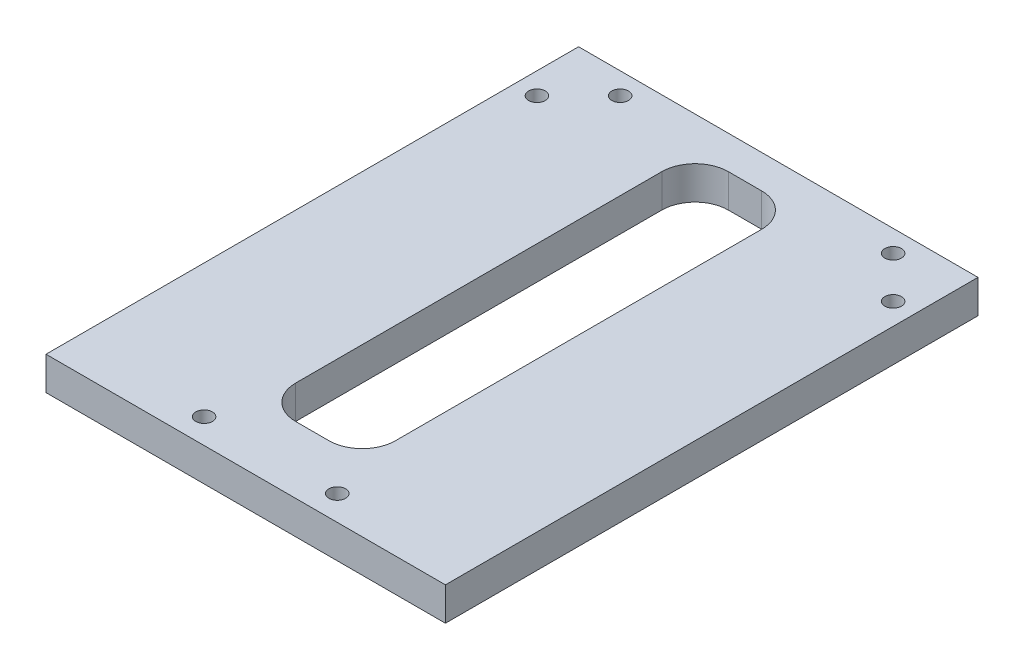
ISO-10303-21;
HEADER;
FILE_DESCRIPTION(('STEP AP214'),'2;1');
FILE_NAME('part.step','',(''),(''),'','','');
FILE_SCHEMA(('AUTOMOTIVE_DESIGN { 1 0 10303 214 1 1 1 1 }'));
ENDSEC;
DATA;
#1=APPLICATION_CONTEXT('core data for automotive mechanical design processes');
#2=APPLICATION_PROTOCOL_DEFINITION('international standard','automotive_design',2000,#1);
#3=PRODUCT_CONTEXT('',#1,'mechanical');
#4=PRODUCT('Part','Part','',(#3));
#5=PRODUCT_RELATED_PRODUCT_CATEGORY('part','',(#4));
#6=PRODUCT_DEFINITION_FORMATION('','',#4);
#7=PRODUCT_DEFINITION_CONTEXT('part definition',#1,'design');
#8=PRODUCT_DEFINITION('design','',#6,#7);
#9=PRODUCT_DEFINITION_SHAPE('','',#8);
#10=(LENGTH_UNIT() NAMED_UNIT(*) SI_UNIT(.MILLI.,.METRE.));
#11=(NAMED_UNIT(*) PLANE_ANGLE_UNIT() SI_UNIT($,.RADIAN.));
#12=(NAMED_UNIT(*) SI_UNIT($,.STERADIAN.) SOLID_ANGLE_UNIT());
#13=UNCERTAINTY_MEASURE_WITH_UNIT(LENGTH_MEASURE(1.E-05),#10,'distance_accuracy_value','');
#14=(GEOMETRIC_REPRESENTATION_CONTEXT(3) GLOBAL_UNCERTAINTY_ASSIGNED_CONTEXT((#13)) GLOBAL_UNIT_ASSIGNED_CONTEXT((#10,
#11,#12)) REPRESENTATION_CONTEXT('',''));
#15=CARTESIAN_POINT('',(0.,0.,0.));
#16=DIRECTION('',(0.,0.,1.));
#17=DIRECTION('',(1.,0.,0.));
#18=AXIS2_PLACEMENT_3D('',#15,#16,#17);
#19=CARTESIAN_POINT('',(19.,-90.,-153.5));
#20=DIRECTION('',(0.,1.,0.));
#21=DIRECTION('',(0.,0.,1.));
#22=AXIS2_PLACEMENT_3D('',#19,#20,#21);
#23=CYLINDRICAL_SURFACE('',#22,2.5);
#24=CARTESIAN_POINT('',(19.,10.,-153.5));
#25=DIRECTION('',(0.,1.,0.));
#26=DIRECTION('',(0.,0.,1.));
#27=AXIS2_PLACEMENT_3D('',#24,#25,#26);
#28=CIRCLE('',#27,2.5);
#29=CARTESIAN_POINT('',(19.,10.,-151.));
#30=VERTEX_POINT('',#29);
#31=EDGE_CURVE('E290',#30,#30,#28,.T.);
#32=ORIENTED_EDGE('',*,*,#31,.T.);
#33=EDGE_LOOP('',(#32));
#34=FACE_BOUND('',#33,.T.);
#35=CARTESIAN_POINT('',(19.,5.,-153.5));
#36=DIRECTION('',(0.,-1.,0.));
#37=DIRECTION('',(0.,0.,-1.));
#38=AXIS2_PLACEMENT_3D('',#35,#36,#37);
#39=CIRCLE('',#38,2.5);
#40=CARTESIAN_POINT('',(19.,5.,-156.));
#41=VERTEX_POINT('',#40);
#42=EDGE_CURVE('E208',#41,#41,#39,.F.);
#43=ORIENTED_EDGE('',*,*,#42,.F.);
#44=EDGE_LOOP('',(#43));
#45=FACE_BOUND('',#44,.T.);
#46=ADVANCED_FACE('F50',(#34,#45),#23,.F.);
#47=CARTESIAN_POINT('',(6.5,-90.,-141.));
#48=DIRECTION('',(0.,1.,0.));
#49=DIRECTION('',(0.,0.,1.));
#50=AXIS2_PLACEMENT_3D('',#47,#48,#49);
#51=CYLINDRICAL_SURFACE('',#50,2.5);
#52=CARTESIAN_POINT('',(6.5,10.,-141.));
#53=DIRECTION('',(0.,1.,0.));
#54=DIRECTION('',(0.,0.,1.));
#55=AXIS2_PLACEMENT_3D('',#52,#53,#54);
#56=CIRCLE('',#55,2.5);
#57=CARTESIAN_POINT('',(6.5,10.,-138.5));
#58=VERTEX_POINT('',#57);
#59=EDGE_CURVE('E292',#58,#58,#56,.T.);
#60=ORIENTED_EDGE('',*,*,#59,.T.);
#61=EDGE_LOOP('',(#60));
#62=FACE_BOUND('',#61,.T.);
#63=CARTESIAN_POINT('',(6.5,5.,-141.));
#64=DIRECTION('',(0.,-1.,0.));
#65=DIRECTION('',(0.,0.,-1.));
#66=AXIS2_PLACEMENT_3D('',#63,#64,#65);
#67=CIRCLE('',#66,2.5);
#68=CARTESIAN_POINT('',(6.5,5.,-143.5));
#69=VERTEX_POINT('',#68);
#70=EDGE_CURVE('E210',#69,#69,#67,.F.);
#71=ORIENTED_EDGE('',*,*,#70,.F.);
#72=EDGE_LOOP('',(#71));
#73=FACE_BOUND('',#72,.T.);
#74=ADVANCED_FACE('F356',(#62,#73),#51,.F.);
#75=CARTESIAN_POINT('',(113.5,-90.,-141.));
#76=DIRECTION('',(0.,1.,0.));
#77=DIRECTION('',(0.,0.,1.));
#78=AXIS2_PLACEMENT_3D('',#75,#76,#77);
#79=CYLINDRICAL_SURFACE('',#78,2.5);
#80=CARTESIAN_POINT('',(113.5,10.,-141.));
#81=DIRECTION('',(0.,1.,0.));
#82=DIRECTION('',(0.,0.,1.));
#83=AXIS2_PLACEMENT_3D('',#80,#81,#82);
#84=CIRCLE('',#83,2.5);
#85=CARTESIAN_POINT('',(113.5,10.,-138.5));
#86=VERTEX_POINT('',#85);
#87=EDGE_CURVE('E214',#86,#86,#84,.T.);
#88=ORIENTED_EDGE('',*,*,#87,.T.);
#89=EDGE_LOOP('',(#88));
#90=FACE_BOUND('',#89,.T.);
#91=CARTESIAN_POINT('',(113.5,5.,-141.));
#92=DIRECTION('',(0.,-1.,0.));
#93=DIRECTION('',(0.,0.,-1.));
#94=AXIS2_PLACEMENT_3D('',#91,#92,#93);
#95=CIRCLE('',#94,2.5);
#96=CARTESIAN_POINT('',(113.5,5.,-143.5));
#97=VERTEX_POINT('',#96);
#98=EDGE_CURVE('E202',#97,#97,#95,.F.);
#99=ORIENTED_EDGE('',*,*,#98,.F.);
#100=EDGE_LOOP('',(#99));
#101=FACE_BOUND('',#100,.T.);
#102=ADVANCED_FACE('F362',(#90,#101),#79,.F.);
#103=CARTESIAN_POINT('',(101.,-90.,-153.5));
#104=DIRECTION('',(0.,1.,0.));
#105=DIRECTION('',(0.,0.,1.));
#106=AXIS2_PLACEMENT_3D('',#103,#104,#105);
#107=CYLINDRICAL_SURFACE('',#106,2.50000000000001);
#108=CARTESIAN_POINT('',(101.,10.,-153.5));
#109=DIRECTION('',(0.,1.,0.));
#110=DIRECTION('',(0.,0.,1.));
#111=AXIS2_PLACEMENT_3D('',#108,#109,#110);
#112=CIRCLE('',#111,2.50000000000001);
#113=CARTESIAN_POINT('',(101.,10.,-151.));
#114=VERTEX_POINT('',#113);
#115=EDGE_CURVE('E288',#114,#114,#112,.T.);
#116=ORIENTED_EDGE('',*,*,#115,.T.);
#117=EDGE_LOOP('',(#116));
#118=FACE_BOUND('',#117,.T.);
#119=CARTESIAN_POINT('',(101.,5.,-153.5));
#120=DIRECTION('',(0.,-1.,0.));
#121=DIRECTION('',(0.,0.,-1.));
#122=AXIS2_PLACEMENT_3D('',#119,#120,#121);
#123=CIRCLE('',#122,2.50000000000001);
#124=CARTESIAN_POINT('',(101.,5.,-156.));
#125=VERTEX_POINT('',#124);
#126=EDGE_CURVE('E197',#125,#125,#123,.F.);
#127=ORIENTED_EDGE('',*,*,#126,.F.);
#128=EDGE_LOOP('',(#127));
#129=FACE_BOUND('',#128,.T.);
#130=ADVANCED_FACE('F375',(#118,#129),#107,.F.);
#131=CARTESIAN_POINT('',(0.,10.,0.));
#132=DIRECTION('',(0.,0.,-1.));
#133=DIRECTION('',(-1.,0.,0.));
#134=AXIS2_PLACEMENT_3D('',#131,#132,#133);
#135=PLANE('',#134);
#136=DIRECTION('',(1.,0.,0.));
#137=VECTOR('',#136,1.);
#138=CARTESIAN_POINT('',(0.,0.,0.));
#139=LINE('',#138,#137);
#140=CARTESIAN_POINT('',(0.,0.,0.));
#141=VERTEX_POINT('',#140);
#142=CARTESIAN_POINT('',(120.,0.,0.));
#143=VERTEX_POINT('',#142);
#144=EDGE_CURVE('E162',#141,#143,#139,.T.);
#145=ORIENTED_EDGE('',*,*,#144,.T.);
#146=DIRECTION('',(0.,-1.,0.));
#147=VECTOR('',#146,1.);
#148=CARTESIAN_POINT('',(120.,10.,0.));
#149=LINE('',#148,#147);
#150=CARTESIAN_POINT('',(120.,10.,0.));
#151=VERTEX_POINT('',#150);
#152=EDGE_CURVE('E141',#151,#143,#149,.T.);
#153=ORIENTED_EDGE('',*,*,#152,.F.);
#154=DIRECTION('',(1.,0.,0.));
#155=VECTOR('',#154,1.);
#156=CARTESIAN_POINT('',(0.,10.,0.));
#157=LINE('',#156,#155);
#158=CARTESIAN_POINT('',(0.,10.,0.));
#159=VERTEX_POINT('',#158);
#160=EDGE_CURVE('E148',#159,#151,#157,.T.);
#161=ORIENTED_EDGE('',*,*,#160,.F.);
#162=DIRECTION('',(0.,-1.,0.));
#163=VECTOR('',#162,1.);
#164=CARTESIAN_POINT('',(0.,10.,0.));
#165=LINE('',#164,#163);
#166=EDGE_CURVE('E311',#159,#141,#165,.T.);
#167=ORIENTED_EDGE('',*,*,#166,.T.);
#168=EDGE_LOOP('',(#145,#153,#161,#167));
#169=FACE_BOUND('',#168,.T.);
#170=ADVANCED_FACE('F156',(#169),#135,.F.);
#171=CARTESIAN_POINT('',(120.,10.,0.));
#172=DIRECTION('',(-1.,0.,0.));
#173=DIRECTION('',(0.,0.,1.));
#174=AXIS2_PLACEMENT_3D('',#171,#172,#173);
#175=PLANE('',#174);
#176=DIRECTION('',(0.,0.,-1.));
#177=VECTOR('',#176,1.);
#178=CARTESIAN_POINT('',(120.,0.,0.));
#179=LINE('',#178,#177);
#180=CARTESIAN_POINT('',(120.,0.,-160.));
#181=VERTEX_POINT('',#180);
#182=EDGE_CURVE('E321',#143,#181,#179,.T.);
#183=ORIENTED_EDGE('',*,*,#182,.T.);
#184=DIRECTION('',(0.,-1.,0.));
#185=VECTOR('',#184,1.);
#186=CARTESIAN_POINT('',(120.,10.,-160.));
#187=LINE('',#186,#185);
#188=CARTESIAN_POINT('',(120.,10.,-160.));
#189=VERTEX_POINT('',#188);
#190=EDGE_CURVE('E143',#189,#181,#187,.T.);
#191=ORIENTED_EDGE('',*,*,#190,.F.);
#192=DIRECTION('',(0.,0.,-1.));
#193=VECTOR('',#192,1.);
#194=CARTESIAN_POINT('',(120.,10.,0.));
#195=LINE('',#194,#193);
#196=EDGE_CURVE('E137',#151,#189,#195,.T.);
#197=ORIENTED_EDGE('',*,*,#196,.F.);
#198=ORIENTED_EDGE('',*,*,#152,.T.);
#199=EDGE_LOOP('',(#183,#191,#197,#198));
#200=FACE_BOUND('',#199,.T.);
#201=ADVANCED_FACE('F142',(#200),#175,.F.);
#202=CARTESIAN_POINT('',(0.,10.,-160.));
#203=DIRECTION('',(0.,0.,-1.));
#204=DIRECTION('',(-1.,0.,0.));
#205=AXIS2_PLACEMENT_3D('',#202,#203,#204);
#206=PLANE('',#205);
#207=DIRECTION('',(1.,0.,0.));
#208=VECTOR('',#207,1.);
#209=CARTESIAN_POINT('',(0.,0.,-160.));
#210=LINE('',#209,#208);
#211=CARTESIAN_POINT('',(0.,0.,-160.));
#212=VERTEX_POINT('',#211);
#213=EDGE_CURVE('E329',#212,#181,#210,.T.);
#214=ORIENTED_EDGE('',*,*,#213,.F.);
#215=DIRECTION('',(0.,-1.,0.));
#216=VECTOR('',#215,1.);
#217=CARTESIAN_POINT('',(0.,10.,-160.));
#218=LINE('',#217,#216);
#219=CARTESIAN_POINT('',(0.,10.,-160.));
#220=VERTEX_POINT('',#219);
#221=EDGE_CURVE('E170',#220,#212,#218,.T.);
#222=ORIENTED_EDGE('',*,*,#221,.F.);
#223=DIRECTION('',(1.,0.,0.));
#224=VECTOR('',#223,1.);
#225=CARTESIAN_POINT('',(0.,10.,-160.));
#226=LINE('',#225,#224);
#227=EDGE_CURVE('E146',#220,#189,#226,.T.);
#228=ORIENTED_EDGE('',*,*,#227,.T.);
#229=ORIENTED_EDGE('',*,*,#190,.T.);
#230=EDGE_LOOP('',(#214,#222,#228,#229));
#231=FACE_BOUND('',#230,.T.);
#232=ADVANCED_FACE('F337',(#231),#206,.T.);
#233=CARTESIAN_POINT('',(75.,10.,0.));
#234=DIRECTION('',(1.,0.,0.));
#235=DIRECTION('',(0.,0.,-1.));
#236=AXIS2_PLACEMENT_3D('',#233,#234,#235);
#237=PLANE('',#236);
#238=DIRECTION('',(0.,0.,1.));
#239=VECTOR('',#238,1.);
#240=CARTESIAN_POINT('',(75.,0.,0.));
#241=LINE('',#240,#239);
#242=CARTESIAN_POINT('',(75.,0.,-140.));
#243=VERTEX_POINT('',#242);
#244=CARTESIAN_POINT('',(75.,0.,-30.));
#245=VERTEX_POINT('',#244);
#246=EDGE_CURVE('E294',#243,#245,#241,.T.);
#247=ORIENTED_EDGE('',*,*,#246,.T.);
#248=DIRECTION('',(0.,-1.,0.));
#249=VECTOR('',#248,1.);
#250=CARTESIAN_POINT('',(75.,10.,-30.));
#251=LINE('',#250,#249);
#252=CARTESIAN_POINT('',(75.,10.,-30.));
#253=VERTEX_POINT('',#252);
#254=EDGE_CURVE('E181',#245,#253,#251,.F.);
#255=ORIENTED_EDGE('',*,*,#254,.T.);
#256=DIRECTION('',(0.,0.,1.));
#257=VECTOR('',#256,1.);
#258=CARTESIAN_POINT('',(75.,10.,0.));
#259=LINE('',#258,#257);
#260=CARTESIAN_POINT('',(75.,10.,-140.));
#261=VERTEX_POINT('',#260);
#262=EDGE_CURVE('E296',#261,#253,#259,.T.);
#263=ORIENTED_EDGE('',*,*,#262,.F.);
#264=DIRECTION('',(0.,-1.,0.));
#265=VECTOR('',#264,1.);
#266=CARTESIAN_POINT('',(75.,10.,-140.));
#267=LINE('',#266,#265);
#268=EDGE_CURVE('E178',#261,#243,#267,.T.);
#269=ORIENTED_EDGE('',*,*,#268,.T.);
#270=EDGE_LOOP('',(#247,#255,#263,#269));
#271=FACE_BOUND('',#270,.T.);
#272=ADVANCED_FACE('F483',(#271),#237,.F.);
#273=CARTESIAN_POINT('',(0.,10.,-20.));
#274=DIRECTION('',(0.,0.,-1.));
#275=DIRECTION('',(-1.,0.,0.));
#276=AXIS2_PLACEMENT_3D('',#273,#274,#275);
#277=PLANE('',#276);
#278=DIRECTION('',(1.,0.,0.));
#279=VECTOR('',#278,1.);
#280=CARTESIAN_POINT('',(0.,0.,-20.));
#281=LINE('',#280,#279);
#282=CARTESIAN_POINT('',(55.,0.,-20.));
#283=VERTEX_POINT('',#282);
#284=CARTESIAN_POINT('',(65.,0.,-20.));
#285=VERTEX_POINT('',#284);
#286=EDGE_CURVE('E313',#283,#285,#281,.T.);
#287=ORIENTED_EDGE('',*,*,#286,.F.);
#288=DIRECTION('',(0.,-1.,0.));
#289=VECTOR('',#288,1.);
#290=CARTESIAN_POINT('',(55.,10.,-20.));
#291=LINE('',#290,#289);
#292=CARTESIAN_POINT('',(55.,10.,-20.));
#293=VERTEX_POINT('',#292);
#294=EDGE_CURVE('E176',#283,#293,#291,.F.);
#295=ORIENTED_EDGE('',*,*,#294,.T.);
#296=DIRECTION('',(1.,0.,0.));
#297=VECTOR('',#296,1.);
#298=CARTESIAN_POINT('',(0.,10.,-20.));
#299=LINE('',#298,#297);
#300=CARTESIAN_POINT('',(65.,10.,-20.));
#301=VERTEX_POINT('',#300);
#302=EDGE_CURVE('E301',#293,#301,#299,.T.);
#303=ORIENTED_EDGE('',*,*,#302,.T.);
#304=DIRECTION('',(0.,-1.,0.));
#305=VECTOR('',#304,1.);
#306=CARTESIAN_POINT('',(65.,10.,-20.));
#307=LINE('',#306,#305);
#308=EDGE_CURVE('E173',#301,#285,#307,.T.);
#309=ORIENTED_EDGE('',*,*,#308,.T.);
#310=EDGE_LOOP('',(#287,#295,#303,#309));
#311=FACE_BOUND('',#310,.T.);
#312=ADVANCED_FACE('F490',(#311),#277,.T.);
#313=CARTESIAN_POINT('',(45.,10.,0.));
#314=DIRECTION('',(1.,0.,0.));
#315=DIRECTION('',(0.,0.,-1.));
#316=AXIS2_PLACEMENT_3D('',#313,#314,#315);
#317=PLANE('',#316);
#318=DIRECTION('',(0.,0.,1.));
#319=VECTOR('',#318,1.);
#320=CARTESIAN_POINT('',(45.,10.,0.));
#321=LINE('',#320,#319);
#322=CARTESIAN_POINT('',(45.,10.,-140.));
#323=VERTEX_POINT('',#322);
#324=CARTESIAN_POINT('',(45.,10.,-30.));
#325=VERTEX_POINT('',#324);
#326=EDGE_CURVE('E304',#323,#325,#321,.T.);
#327=ORIENTED_EDGE('',*,*,#326,.T.);
#328=DIRECTION('',(0.,-1.,0.));
#329=VECTOR('',#328,1.);
#330=CARTESIAN_POINT('',(45.,0.,-30.));
#331=LINE('',#330,#329);
#332=CARTESIAN_POINT('',(45.,0.,-30.));
#333=VERTEX_POINT('',#332);
#334=EDGE_CURVE('E164',#325,#333,#331,.T.);
#335=ORIENTED_EDGE('',*,*,#334,.T.);
#336=DIRECTION('',(0.,0.,1.));
#337=VECTOR('',#336,1.);
#338=CARTESIAN_POINT('',(45.,0.,0.));
#339=LINE('',#338,#337);
#340=CARTESIAN_POINT('',(45.,0.,-140.));
#341=VERTEX_POINT('',#340);
#342=EDGE_CURVE('E320',#341,#333,#339,.T.);
#343=ORIENTED_EDGE('',*,*,#342,.F.);
#344=DIRECTION('',(0.,-1.,0.));
#345=VECTOR('',#344,1.);
#346=CARTESIAN_POINT('',(45.,10.,-140.));
#347=LINE('',#346,#345);
#348=EDGE_CURVE('E161',#341,#323,#347,.F.);
#349=ORIENTED_EDGE('',*,*,#348,.T.);
#350=EDGE_LOOP('',(#327,#335,#343,#349));
#351=FACE_BOUND('',#350,.T.);
#352=ADVANCED_FACE('F496',(#351),#317,.T.);
#353=CARTESIAN_POINT('',(0.,10.,-150.));
#354=DIRECTION('',(0.,0.,1.));
#355=DIRECTION('',(1.,0.,0.));
#356=AXIS2_PLACEMENT_3D('',#353,#354,#355);
#357=PLANE('',#356);
#358=DIRECTION('',(-1.,0.,0.));
#359=VECTOR('',#358,1.);
#360=CARTESIAN_POINT('',(0.,0.,-150.));
#361=LINE('',#360,#359);
#362=CARTESIAN_POINT('',(65.,0.,-150.));
#363=VERTEX_POINT('',#362);
#364=CARTESIAN_POINT('',(55.,0.,-150.));
#365=VERTEX_POINT('',#364);
#366=EDGE_CURVE('E318',#363,#365,#361,.T.);
#367=ORIENTED_EDGE('',*,*,#366,.F.);
#368=DIRECTION('',(0.,-1.,0.));
#369=VECTOR('',#368,1.);
#370=CARTESIAN_POINT('',(65.,10.,-150.));
#371=LINE('',#370,#369);
#372=CARTESIAN_POINT('',(65.,10.,-150.));
#373=VERTEX_POINT('',#372);
#374=EDGE_CURVE('E68',#363,#373,#371,.F.);
#375=ORIENTED_EDGE('',*,*,#374,.T.);
#376=DIRECTION('',(-1.,0.,0.));
#377=VECTOR('',#376,1.);
#378=CARTESIAN_POINT('',(0.,10.,-150.));
#379=LINE('',#378,#377);
#380=CARTESIAN_POINT('',(55.,10.,-150.));
#381=VERTEX_POINT('',#380);
#382=EDGE_CURVE('E157',#373,#381,#379,.T.);
#383=ORIENTED_EDGE('',*,*,#382,.T.);
#384=DIRECTION('',(0.,-1.,0.));
#385=VECTOR('',#384,1.);
#386=CARTESIAN_POINT('',(55.,0.,-150.));
#387=LINE('',#386,#385);
#388=EDGE_CURVE('E182',#381,#365,#387,.T.);
#389=ORIENTED_EDGE('',*,*,#388,.T.);
#390=EDGE_LOOP('',(#367,#375,#383,#389));
#391=FACE_BOUND('',#390,.T.);
#392=ADVANCED_FACE('F497',(#391),#357,.T.);
#393=CARTESIAN_POINT('',(0.,10.,0.));
#394=DIRECTION('',(-1.,0.,0.));
#395=DIRECTION('',(0.,0.,1.));
#396=AXIS2_PLACEMENT_3D('',#393,#394,#395);
#397=PLANE('',#396);
#398=DIRECTION('',(0.,0.,-1.));
#399=VECTOR('',#398,1.);
#400=CARTESIAN_POINT('',(0.,0.,0.));
#401=LINE('',#400,#399);
#402=EDGE_CURVE('E305',#141,#212,#401,.T.);
#403=ORIENTED_EDGE('',*,*,#402,.F.);
#404=ORIENTED_EDGE('',*,*,#166,.F.);
#405=DIRECTION('',(0.,0.,-1.));
#406=VECTOR('',#405,1.);
#407=CARTESIAN_POINT('',(0.,10.,0.));
#408=LINE('',#407,#406);
#409=EDGE_CURVE('E158',#159,#220,#408,.T.);
#410=ORIENTED_EDGE('',*,*,#409,.T.);
#411=ORIENTED_EDGE('',*,*,#221,.T.);
#412=EDGE_LOOP('',(#403,#404,#410,#411));
#413=FACE_BOUND('',#412,.T.);
#414=ADVANCED_FACE('F335',(#413),#397,.T.);
#415=CARTESIAN_POINT('',(0.,10.,0.));
#416=DIRECTION('',(0.,1.,0.));
#417=DIRECTION('',(0.,0.,1.));
#418=AXIS2_PLACEMENT_3D('',#415,#416,#417);
#419=PLANE('',#418);
#420=CARTESIAN_POINT('',(40.,10.,-7.5));
#421=DIRECTION('',(0.,1.,0.));
#422=DIRECTION('',(0.,0.,1.));
#423=AXIS2_PLACEMENT_3D('',#420,#421,#422);
#424=CIRCLE('',#423,2.5);
#425=CARTESIAN_POINT('',(40.,10.,-5.));
#426=VERTEX_POINT('',#425);
#427=EDGE_CURVE('E51',#426,#426,#424,.T.);
#428=ORIENTED_EDGE('',*,*,#427,.F.);
#429=EDGE_LOOP('',(#428));
#430=FACE_BOUND('',#429,.T.);
#431=CARTESIAN_POINT('',(80.,10.,-7.5));
#432=DIRECTION('',(0.,1.,0.));
#433=DIRECTION('',(0.,0.,1.));
#434=AXIS2_PLACEMENT_3D('',#431,#432,#433);
#435=CIRCLE('',#434,2.5);
#436=CARTESIAN_POINT('',(80.,10.,-5.));
#437=VERTEX_POINT('',#436);
#438=EDGE_CURVE('E223',#437,#437,#435,.T.);
#439=ORIENTED_EDGE('',*,*,#438,.F.);
#440=EDGE_LOOP('',(#439));
#441=FACE_BOUND('',#440,.T.);
#442=ORIENTED_EDGE('',*,*,#115,.F.);
#443=EDGE_LOOP('',(#442));
#444=FACE_BOUND('',#443,.T.);
#445=ORIENTED_EDGE('',*,*,#87,.F.);
#446=EDGE_LOOP('',(#445));
#447=FACE_BOUND('',#446,.T.);
#448=ORIENTED_EDGE('',*,*,#59,.F.);
#449=EDGE_LOOP('',(#448));
#450=FACE_BOUND('',#449,.T.);
#451=ORIENTED_EDGE('',*,*,#31,.F.);
#452=EDGE_LOOP('',(#451));
#453=FACE_BOUND('',#452,.T.);
#454=ORIENTED_EDGE('',*,*,#382,.F.);
#455=CARTESIAN_POINT('',(65.,10.,-140.));
#456=DIRECTION('',(0.,1.,0.));
#457=DIRECTION('',(0.,0.,1.));
#458=AXIS2_PLACEMENT_3D('',#455,#456,#457);
#459=CIRCLE('',#458,10.);
#460=EDGE_CURVE('E196',#373,#261,#459,.F.);
#461=ORIENTED_EDGE('',*,*,#460,.T.);
#462=ORIENTED_EDGE('',*,*,#262,.T.);
#463=CARTESIAN_POINT('',(65.,10.,-30.));
#464=DIRECTION('',(0.,1.,0.));
#465=DIRECTION('',(0.,0.,1.));
#466=AXIS2_PLACEMENT_3D('',#463,#464,#465);
#467=CIRCLE('',#466,10.);
#468=EDGE_CURVE('E194',#253,#301,#467,.F.);
#469=ORIENTED_EDGE('',*,*,#468,.T.);
#470=ORIENTED_EDGE('',*,*,#302,.F.);
#471=CARTESIAN_POINT('',(55.,10.,-30.));
#472=DIRECTION('',(0.,1.,0.));
#473=DIRECTION('',(0.,0.,1.));
#474=AXIS2_PLACEMENT_3D('',#471,#472,#473);
#475=CIRCLE('',#474,10.);
#476=EDGE_CURVE('E186',#293,#325,#475,.F.);
#477=ORIENTED_EDGE('',*,*,#476,.T.);
#478=ORIENTED_EDGE('',*,*,#326,.F.);
#479=CARTESIAN_POINT('',(55.,10.,-140.));
#480=DIRECTION('',(0.,1.,0.));
#481=DIRECTION('',(0.,0.,1.));
#482=AXIS2_PLACEMENT_3D('',#479,#480,#481);
#483=CIRCLE('',#482,10.);
#484=EDGE_CURVE('E11',#323,#381,#483,.F.);
#485=ORIENTED_EDGE('',*,*,#484,.T.);
#486=EDGE_LOOP('',(#454,#461,#462,#469,#470,#477,#478,#485));
#487=FACE_BOUND('',#486,.T.);
#488=ORIENTED_EDGE('',*,*,#160,.T.);
#489=ORIENTED_EDGE('',*,*,#196,.T.);
#490=ORIENTED_EDGE('',*,*,#227,.F.);
#491=ORIENTED_EDGE('',*,*,#409,.F.);
#492=EDGE_LOOP('',(#488,#489,#490,#491));
#493=FACE_BOUND('',#492,.T.);
#494=ADVANCED_FACE('F153',(#430,#441,#444,#447,#450,#453,#487,#493),#419,.T.);
#495=CARTESIAN_POINT('',(0.,0.,0.));
#496=DIRECTION('',(0.,1.,0.));
#497=DIRECTION('',(0.,0.,1.));
#498=AXIS2_PLACEMENT_3D('',#495,#496,#497);
#499=PLANE('',#498);
#500=CARTESIAN_POINT('',(80.,0.,-7.5));
#501=DIRECTION('',(0.,1.,0.));
#502=DIRECTION('',(0.,0.,1.));
#503=AXIS2_PLACEMENT_3D('',#500,#501,#502);
#504=CIRCLE('',#503,5.);
#505=CARTESIAN_POINT('',(80.,0.,-2.5));
#506=VERTEX_POINT('',#505);
#507=EDGE_CURVE('E216',#506,#506,#504,.F.);
#508=ORIENTED_EDGE('',*,*,#507,.F.);
#509=EDGE_LOOP('',(#508));
#510=FACE_BOUND('',#509,.T.);
#511=CARTESIAN_POINT('',(40.,0.,-7.5));
#512=DIRECTION('',(0.,1.,0.));
#513=DIRECTION('',(0.,0.,1.));
#514=AXIS2_PLACEMENT_3D('',#511,#512,#513);
#515=CIRCLE('',#514,5.);
#516=CARTESIAN_POINT('',(40.,0.,-2.5));
#517=VERTEX_POINT('',#516);
#518=EDGE_CURVE('E211',#517,#517,#515,.F.);
#519=ORIENTED_EDGE('',*,*,#518,.F.);
#520=EDGE_LOOP('',(#519));
#521=FACE_BOUND('',#520,.T.);
#522=CARTESIAN_POINT('',(112.5,0.,-7.5));
#523=DIRECTION('',(0.,-1.,0.));
#524=DIRECTION('',(0.,0.,-1.));
#525=AXIS2_PLACEMENT_3D('',#522,#523,#524);
#526=CIRCLE('',#525,2.25);
#527=CARTESIAN_POINT('',(112.5,0.,-9.74999999999999));
#528=VERTEX_POINT('',#527);
#529=EDGE_CURVE('E242',#528,#528,#526,.T.);
#530=ORIENTED_EDGE('',*,*,#529,.F.);
#531=EDGE_LOOP('',(#530));
#532=FACE_BOUND('',#531,.T.);
#533=CARTESIAN_POINT('',(7.5,0.,-7.5));
#534=DIRECTION('',(0.,-1.,0.));
#535=DIRECTION('',(0.,0.,-1.));
#536=AXIS2_PLACEMENT_3D('',#533,#534,#535);
#537=CIRCLE('',#536,2.25);
#538=CARTESIAN_POINT('',(7.5,0.,-9.75));
#539=VERTEX_POINT('',#538);
#540=EDGE_CURVE('E217',#539,#539,#537,.T.);
#541=ORIENTED_EDGE('',*,*,#540,.F.);
#542=EDGE_LOOP('',(#541));
#543=FACE_BOUND('',#542,.T.);
#544=CARTESIAN_POINT('',(7.5,0.,-153.623044918261));
#545=DIRECTION('',(0.,-1.,0.));
#546=DIRECTION('',(0.,0.,-1.));
#547=AXIS2_PLACEMENT_3D('',#544,#545,#546);
#548=CIRCLE('',#547,2.25);
#549=CARTESIAN_POINT('',(7.5,0.,-155.873044918261));
#550=VERTEX_POINT('',#549);
#551=EDGE_CURVE('E243',#550,#550,#548,.T.);
#552=ORIENTED_EDGE('',*,*,#551,.F.);
#553=EDGE_LOOP('',(#552));
#554=FACE_BOUND('',#553,.T.);
#555=CARTESIAN_POINT('',(112.5,0.,-152.5));
#556=DIRECTION('',(0.,-1.,0.));
#557=DIRECTION('',(0.,0.,-1.));
#558=AXIS2_PLACEMENT_3D('',#555,#556,#557);
#559=CIRCLE('',#558,2.25);
#560=CARTESIAN_POINT('',(112.5,0.,-154.75));
#561=VERTEX_POINT('',#560);
#562=EDGE_CURVE('E253',#561,#561,#559,.T.);
#563=ORIENTED_EDGE('',*,*,#562,.F.);
#564=EDGE_LOOP('',(#563));
#565=FACE_BOUND('',#564,.T.);
#566=CARTESIAN_POINT('',(6.5,0.,-141.));
#567=DIRECTION('',(0.,-1.,0.));
#568=DIRECTION('',(0.,0.,-1.));
#569=AXIS2_PLACEMENT_3D('',#566,#567,#568);
#570=CIRCLE('',#569,5.);
#571=CARTESIAN_POINT('',(6.5,0.,-146.));
#572=VERTEX_POINT('',#571);
#573=EDGE_CURVE('E268',#572,#572,#570,.T.);
#574=ORIENTED_EDGE('',*,*,#573,.F.);
#575=EDGE_LOOP('',(#574));
#576=FACE_BOUND('',#575,.T.);
#577=CARTESIAN_POINT('',(101.,0.,-153.5));
#578=DIRECTION('',(0.,-1.,0.));
#579=DIRECTION('',(0.,0.,-1.));
#580=AXIS2_PLACEMENT_3D('',#577,#578,#579);
#581=CIRCLE('',#580,5.00000000000001);
#582=CARTESIAN_POINT('',(101.,0.,-158.5));
#583=VERTEX_POINT('',#582);
#584=EDGE_CURVE('E266',#583,#583,#581,.T.);
#585=ORIENTED_EDGE('',*,*,#584,.F.);
#586=EDGE_LOOP('',(#585));
#587=FACE_BOUND('',#586,.T.);
#588=CARTESIAN_POINT('',(113.5,0.,-141.));
#589=DIRECTION('',(0.,-1.,0.));
#590=DIRECTION('',(0.,0.,-1.));
#591=AXIS2_PLACEMENT_3D('',#588,#589,#590);
#592=CIRCLE('',#591,5.00000000000001);
#593=CARTESIAN_POINT('',(113.5,0.,-146.));
#594=VERTEX_POINT('',#593);
#595=EDGE_CURVE('E284',#594,#594,#592,.T.);
#596=ORIENTED_EDGE('',*,*,#595,.F.);
#597=EDGE_LOOP('',(#596));
#598=FACE_BOUND('',#597,.T.);
#599=CARTESIAN_POINT('',(19.,0.,-153.5));
#600=DIRECTION('',(0.,-1.,0.));
#601=DIRECTION('',(0.,0.,-1.));
#602=AXIS2_PLACEMENT_3D('',#599,#600,#601);
#603=CIRCLE('',#602,5.);
#604=CARTESIAN_POINT('',(19.,0.,-158.5));
#605=VERTEX_POINT('',#604);
#606=EDGE_CURVE('E270',#605,#605,#603,.T.);
#607=ORIENTED_EDGE('',*,*,#606,.F.);
#608=EDGE_LOOP('',(#607));
#609=FACE_BOUND('',#608,.T.);
#610=ORIENTED_EDGE('',*,*,#246,.F.);
#611=CARTESIAN_POINT('',(65.,0.,-140.));
#612=DIRECTION('',(0.,1.,0.));
#613=DIRECTION('',(0.,0.,1.));
#614=AXIS2_PLACEMENT_3D('',#611,#612,#613);
#615=CIRCLE('',#614,10.);
#616=EDGE_CURVE('E193',#243,#363,#615,.T.);
#617=ORIENTED_EDGE('',*,*,#616,.T.);
#618=ORIENTED_EDGE('',*,*,#366,.T.);
#619=CARTESIAN_POINT('',(55.,0.,-140.));
#620=DIRECTION('',(0.,1.,0.));
#621=DIRECTION('',(0.,0.,1.));
#622=AXIS2_PLACEMENT_3D('',#619,#620,#621);
#623=CIRCLE('',#622,10.);
#624=EDGE_CURVE('E57',#365,#341,#623,.T.);
#625=ORIENTED_EDGE('',*,*,#624,.T.);
#626=ORIENTED_EDGE('',*,*,#342,.T.);
#627=CARTESIAN_POINT('',(55.,0.,-30.));
#628=DIRECTION('',(0.,1.,0.));
#629=DIRECTION('',(0.,0.,1.));
#630=AXIS2_PLACEMENT_3D('',#627,#628,#629);
#631=CIRCLE('',#630,10.);
#632=EDGE_CURVE('E190',#333,#283,#631,.T.);
#633=ORIENTED_EDGE('',*,*,#632,.T.);
#634=ORIENTED_EDGE('',*,*,#286,.T.);
#635=CARTESIAN_POINT('',(65.,0.,-30.));
#636=DIRECTION('',(0.,1.,0.));
#637=DIRECTION('',(0.,0.,1.));
#638=AXIS2_PLACEMENT_3D('',#635,#636,#637);
#639=CIRCLE('',#638,10.);
#640=EDGE_CURVE('E192',#285,#245,#639,.T.);
#641=ORIENTED_EDGE('',*,*,#640,.T.);
#642=EDGE_LOOP('',(#610,#617,#618,#625,#626,#633,#634,#641));
#643=FACE_BOUND('',#642,.T.);
#644=ORIENTED_EDGE('',*,*,#144,.F.);
#645=ORIENTED_EDGE('',*,*,#402,.T.);
#646=ORIENTED_EDGE('',*,*,#213,.T.);
#647=ORIENTED_EDGE('',*,*,#182,.F.);
#648=EDGE_LOOP('',(#644,#645,#646,#647));
#649=FACE_BOUND('',#648,.T.);
#650=ADVANCED_FACE('F336',(#510,#521,#532,#543,#554,#565,#576,#587,#598,#609,#643,#649),#499,.F.);
#651=CARTESIAN_POINT('',(55.,10.,-30.));
#652=DIRECTION('',(0.,1.,0.));
#653=DIRECTION('',(0.,0.,1.));
#654=AXIS2_PLACEMENT_3D('',#651,#652,#653);
#655=CYLINDRICAL_SURFACE('',#654,10.);
#656=ORIENTED_EDGE('',*,*,#476,.F.);
#657=ORIENTED_EDGE('',*,*,#294,.F.);
#658=ORIENTED_EDGE('',*,*,#632,.F.);
#659=ORIENTED_EDGE('',*,*,#334,.F.);
#660=EDGE_LOOP('',(#656,#657,#658,#659));
#661=FACE_BOUND('',#660,.T.);
#662=ADVANCED_FACE('F338',(#661),#655,.F.);
#663=CARTESIAN_POINT('',(65.,10.,-30.));
#664=DIRECTION('',(0.,-1.,0.));
#665=DIRECTION('',(0.,0.,-1.));
#666=AXIS2_PLACEMENT_3D('',#663,#664,#665);
#667=CYLINDRICAL_SURFACE('',#666,10.);
#668=ORIENTED_EDGE('',*,*,#468,.F.);
#669=ORIENTED_EDGE('',*,*,#254,.F.);
#670=ORIENTED_EDGE('',*,*,#640,.F.);
#671=ORIENTED_EDGE('',*,*,#308,.F.);
#672=EDGE_LOOP('',(#668,#669,#670,#671));
#673=FACE_BOUND('',#672,.T.);
#674=ADVANCED_FACE('F350',(#673),#667,.F.);
#675=CARTESIAN_POINT('',(65.,10.,-140.));
#676=DIRECTION('',(0.,-1.,0.));
#677=DIRECTION('',(0.,0.,-1.));
#678=AXIS2_PLACEMENT_3D('',#675,#676,#677);
#679=CYLINDRICAL_SURFACE('',#678,10.);
#680=ORIENTED_EDGE('',*,*,#460,.F.);
#681=ORIENTED_EDGE('',*,*,#374,.F.);
#682=ORIENTED_EDGE('',*,*,#616,.F.);
#683=ORIENTED_EDGE('',*,*,#268,.F.);
#684=EDGE_LOOP('',(#680,#681,#682,#683));
#685=FACE_BOUND('',#684,.T.);
#686=ADVANCED_FACE('F480',(#685),#679,.F.);
#687=CARTESIAN_POINT('',(55.,10.,-140.));
#688=DIRECTION('',(0.,1.,0.));
#689=DIRECTION('',(0.,0.,1.));
#690=AXIS2_PLACEMENT_3D('',#687,#688,#689);
#691=CYLINDRICAL_SURFACE('',#690,10.);
#692=ORIENTED_EDGE('',*,*,#484,.F.);
#693=ORIENTED_EDGE('',*,*,#348,.F.);
#694=ORIENTED_EDGE('',*,*,#624,.F.);
#695=ORIENTED_EDGE('',*,*,#388,.F.);
#696=EDGE_LOOP('',(#692,#693,#694,#695));
#697=FACE_BOUND('',#696,.T.);
#698=ADVANCED_FACE('F47',(#697),#691,.F.);
#699=CARTESIAN_POINT('',(101.,5.,-153.5));
#700=DIRECTION('',(0.,-1.,0.));
#701=DIRECTION('',(0.,0.,-1.));
#702=AXIS2_PLACEMENT_3D('',#699,#700,#701);
#703=PLANE('',#702);
#704=CARTESIAN_POINT('',(101.,5.,-153.5));
#705=DIRECTION('',(0.,-1.,0.));
#706=DIRECTION('',(0.,0.,-1.));
#707=AXIS2_PLACEMENT_3D('',#704,#705,#706);
#708=CIRCLE('',#707,5.00000000000001);
#709=CARTESIAN_POINT('',(101.,5.,-158.5));
#710=VERTEX_POINT('',#709);
#711=EDGE_CURVE('E264',#710,#710,#708,.T.);
#712=ORIENTED_EDGE('',*,*,#711,.T.);
#713=EDGE_LOOP('',(#712));
#714=FACE_BOUND('',#713,.T.);
#715=ORIENTED_EDGE('',*,*,#126,.T.);
#716=EDGE_LOOP('',(#715));
#717=FACE_BOUND('',#716,.T.);
#718=ADVANCED_FACE('F399',(#714,#717),#703,.T.);
#719=CARTESIAN_POINT('',(101.,5.,-153.5));
#720=DIRECTION('',(0.,-1.,0.));
#721=DIRECTION('',(0.,0.,-1.));
#722=AXIS2_PLACEMENT_3D('',#719,#720,#721);
#723=CYLINDRICAL_SURFACE('',#722,5.00000000000001);
#724=ORIENTED_EDGE('',*,*,#711,.F.);
#725=EDGE_LOOP('',(#724));
#726=FACE_BOUND('',#725,.T.);
#727=ORIENTED_EDGE('',*,*,#584,.T.);
#728=EDGE_LOOP('',(#727));
#729=FACE_BOUND('',#728,.T.);
#730=ADVANCED_FACE('F382',(#726,#729),#723,.F.);
#731=CARTESIAN_POINT('',(113.5,5.,-141.));
#732=DIRECTION('',(0.,-1.,0.));
#733=DIRECTION('',(0.,0.,-1.));
#734=AXIS2_PLACEMENT_3D('',#731,#732,#733);
#735=PLANE('',#734);
#736=CARTESIAN_POINT('',(113.5,5.,-141.));
#737=DIRECTION('',(0.,-1.,0.));
#738=DIRECTION('',(0.,0.,-1.));
#739=AXIS2_PLACEMENT_3D('',#736,#737,#738);
#740=CIRCLE('',#739,5.00000000000001);
#741=CARTESIAN_POINT('',(113.5,5.,-146.));
#742=VERTEX_POINT('',#741);
#743=EDGE_CURVE('E271',#742,#742,#740,.T.);
#744=ORIENTED_EDGE('',*,*,#743,.T.);
#745=EDGE_LOOP('',(#744));
#746=FACE_BOUND('',#745,.T.);
#747=ORIENTED_EDGE('',*,*,#98,.T.);
#748=EDGE_LOOP('',(#747));
#749=FACE_BOUND('',#748,.T.);
#750=ADVANCED_FACE('F380',(#746,#749),#735,.T.);
#751=CARTESIAN_POINT('',(113.5,5.,-141.));
#752=DIRECTION('',(0.,-1.,0.));
#753=DIRECTION('',(0.,0.,-1.));
#754=AXIS2_PLACEMENT_3D('',#751,#752,#753);
#755=CYLINDRICAL_SURFACE('',#754,5.00000000000001);
#756=ORIENTED_EDGE('',*,*,#743,.F.);
#757=EDGE_LOOP('',(#756));
#758=FACE_BOUND('',#757,.T.);
#759=ORIENTED_EDGE('',*,*,#595,.T.);
#760=EDGE_LOOP('',(#759));
#761=FACE_BOUND('',#760,.T.);
#762=ADVANCED_FACE('F379',(#758,#761),#755,.F.);
#763=CARTESIAN_POINT('',(6.5,5.,-141.));
#764=DIRECTION('',(0.,-1.,0.));
#765=DIRECTION('',(0.,0.,-1.));
#766=AXIS2_PLACEMENT_3D('',#763,#764,#765);
#767=PLANE('',#766);
#768=CARTESIAN_POINT('',(6.5,5.,-141.));
#769=DIRECTION('',(0.,-1.,0.));
#770=DIRECTION('',(0.,0.,-1.));
#771=AXIS2_PLACEMENT_3D('',#768,#769,#770);
#772=CIRCLE('',#771,5.);
#773=CARTESIAN_POINT('',(6.5,5.,-146.));
#774=VERTEX_POINT('',#773);
#775=EDGE_CURVE('E205',#774,#774,#772,.T.);
#776=ORIENTED_EDGE('',*,*,#775,.T.);
#777=EDGE_LOOP('',(#776));
#778=FACE_BOUND('',#777,.T.);
#779=ORIENTED_EDGE('',*,*,#70,.T.);
#780=EDGE_LOOP('',(#779));
#781=FACE_BOUND('',#780,.T.);
#782=ADVANCED_FACE('F383',(#778,#781),#767,.T.);
#783=CARTESIAN_POINT('',(6.5,5.,-141.));
#784=DIRECTION('',(0.,-1.,0.));
#785=DIRECTION('',(0.,0.,-1.));
#786=AXIS2_PLACEMENT_3D('',#783,#784,#785);
#787=CYLINDRICAL_SURFACE('',#786,5.);
#788=ORIENTED_EDGE('',*,*,#775,.F.);
#789=EDGE_LOOP('',(#788));
#790=FACE_BOUND('',#789,.T.);
#791=ORIENTED_EDGE('',*,*,#573,.T.);
#792=EDGE_LOOP('',(#791));
#793=FACE_BOUND('',#792,.T.);
#794=ADVANCED_FACE('F394',(#790,#793),#787,.F.);
#795=CARTESIAN_POINT('',(19.,5.,-153.5));
#796=DIRECTION('',(0.,-1.,0.));
#797=DIRECTION('',(0.,0.,-1.));
#798=AXIS2_PLACEMENT_3D('',#795,#796,#797);
#799=PLANE('',#798);
#800=CARTESIAN_POINT('',(19.,5.,-153.5));
#801=DIRECTION('',(0.,-1.,0.));
#802=DIRECTION('',(0.,0.,-1.));
#803=AXIS2_PLACEMENT_3D('',#800,#801,#802);
#804=CIRCLE('',#803,5.);
#805=CARTESIAN_POINT('',(19.,5.,-158.5));
#806=VERTEX_POINT('',#805);
#807=EDGE_CURVE('E279',#806,#806,#804,.T.);
#808=ORIENTED_EDGE('',*,*,#807,.T.);
#809=EDGE_LOOP('',(#808));
#810=FACE_BOUND('',#809,.T.);
#811=ORIENTED_EDGE('',*,*,#42,.T.);
#812=EDGE_LOOP('',(#811));
#813=FACE_BOUND('',#812,.T.);
#814=ADVANCED_FACE('F390',(#810,#813),#799,.T.);
#815=CARTESIAN_POINT('',(19.,5.,-153.5));
#816=DIRECTION('',(0.,-1.,0.));
#817=DIRECTION('',(0.,0.,-1.));
#818=AXIS2_PLACEMENT_3D('',#815,#816,#817);
#819=CYLINDRICAL_SURFACE('',#818,5.);
#820=ORIENTED_EDGE('',*,*,#807,.F.);
#821=EDGE_LOOP('',(#820));
#822=FACE_BOUND('',#821,.T.);
#823=ORIENTED_EDGE('',*,*,#606,.T.);
#824=EDGE_LOOP('',(#823));
#825=FACE_BOUND('',#824,.T.);
#826=ADVANCED_FACE('F388',(#822,#825),#819,.F.);
#827=CARTESIAN_POINT('',(112.5,5.,-152.5));
#828=DIRECTION('',(0.,-1.,0.));
#829=DIRECTION('',(0.,0.,-1.));
#830=AXIS2_PLACEMENT_3D('',#827,#828,#829);
#831=CYLINDRICAL_SURFACE('',#830,2.25);
#832=CARTESIAN_POINT('',(112.5,5.,-152.5));
#833=DIRECTION('',(0.,-1.,0.));
#834=DIRECTION('',(0.,0.,-1.));
#835=AXIS2_PLACEMENT_3D('',#832,#833,#834);
#836=CIRCLE('',#835,2.25);
#837=CARTESIAN_POINT('',(112.5,5.,-154.75));
#838=VERTEX_POINT('',#837);
#839=EDGE_CURVE('E259',#838,#838,#836,.T.);
#840=ORIENTED_EDGE('',*,*,#839,.F.);
#841=EDGE_LOOP('',(#840));
#842=FACE_BOUND('',#841,.T.);
#843=ORIENTED_EDGE('',*,*,#562,.T.);
#844=EDGE_LOOP('',(#843));
#845=FACE_BOUND('',#844,.T.);
#846=ADVANCED_FACE('F392',(#842,#845),#831,.F.);
#847=CARTESIAN_POINT('',(112.5,5.,-152.5));
#848=DIRECTION('',(0.,-1.,0.));
#849=DIRECTION('',(0.,0.,-1.));
#850=AXIS2_PLACEMENT_3D('',#847,#848,#849);
#851=PLANE('',#850);
#852=ORIENTED_EDGE('',*,*,#839,.T.);
#853=EDGE_LOOP('',(#852));
#854=FACE_BOUND('',#853,.T.);
#855=ADVANCED_FACE('F411',(#854),#851,.T.);
#856=CARTESIAN_POINT('',(7.5,5.,-153.623044918261));
#857=DIRECTION('',(0.,-1.,0.));
#858=DIRECTION('',(0.,0.,-1.));
#859=AXIS2_PLACEMENT_3D('',#856,#857,#858);
#860=CYLINDRICAL_SURFACE('',#859,2.25);
#861=CARTESIAN_POINT('',(7.5,5.,-153.623044918261));
#862=DIRECTION('',(0.,-1.,0.));
#863=DIRECTION('',(0.,0.,-1.));
#864=AXIS2_PLACEMENT_3D('',#861,#862,#863);
#865=CIRCLE('',#864,2.25);
#866=CARTESIAN_POINT('',(7.5,5.,-155.873044918261));
#867=VERTEX_POINT('',#866);
#868=EDGE_CURVE('E255',#867,#867,#865,.T.);
#869=ORIENTED_EDGE('',*,*,#868,.F.);
#870=EDGE_LOOP('',(#869));
#871=FACE_BOUND('',#870,.T.);
#872=ORIENTED_EDGE('',*,*,#551,.T.);
#873=EDGE_LOOP('',(#872));
#874=FACE_BOUND('',#873,.T.);
#875=ADVANCED_FACE('F418',(#871,#874),#860,.F.);
#876=CARTESIAN_POINT('',(0.,5.,0.));
#877=DIRECTION('',(0.,-1.,0.));
#878=DIRECTION('',(0.,0.,-1.));
#879=AXIS2_PLACEMENT_3D('',#876,#877,#878);
#880=PLANE('',#879);
#881=ORIENTED_EDGE('',*,*,#868,.T.);
#882=EDGE_LOOP('',(#881));
#883=FACE_BOUND('',#882,.T.);
#884=ADVANCED_FACE('F416',(#883),#880,.T.);
#885=CARTESIAN_POINT('',(7.5,5.,-7.5));
#886=DIRECTION('',(0.,-1.,0.));
#887=DIRECTION('',(0.,0.,-1.));
#888=AXIS2_PLACEMENT_3D('',#885,#886,#887);
#889=CYLINDRICAL_SURFACE('',#888,2.25);
#890=CARTESIAN_POINT('',(7.5,5.,-7.5));
#891=DIRECTION('',(0.,-1.,0.));
#892=DIRECTION('',(0.,0.,-1.));
#893=AXIS2_PLACEMENT_3D('',#890,#891,#892);
#894=CIRCLE('',#893,2.25);
#895=CARTESIAN_POINT('',(7.5,5.,-9.75));
#896=VERTEX_POINT('',#895);
#897=EDGE_CURVE('E250',#896,#896,#894,.T.);
#898=ORIENTED_EDGE('',*,*,#897,.F.);
#899=EDGE_LOOP('',(#898));
#900=FACE_BOUND('',#899,.T.);
#901=ORIENTED_EDGE('',*,*,#540,.T.);
#902=EDGE_LOOP('',(#901));
#903=FACE_BOUND('',#902,.T.);
#904=ADVANCED_FACE('F425',(#900,#903),#889,.F.);
#905=CARTESIAN_POINT('',(0.,5.,0.));
#906=DIRECTION('',(0.,-1.,0.));
#907=DIRECTION('',(0.,0.,-1.));
#908=AXIS2_PLACEMENT_3D('',#905,#906,#907);
#909=PLANE('',#908);
#910=ORIENTED_EDGE('',*,*,#897,.T.);
#911=EDGE_LOOP('',(#910));
#912=FACE_BOUND('',#911,.T.);
#913=ADVANCED_FACE('F426',(#912),#909,.T.);
#914=CARTESIAN_POINT('',(112.5,5.,-7.5));
#915=DIRECTION('',(0.,-1.,0.));
#916=DIRECTION('',(0.,0.,-1.));
#917=AXIS2_PLACEMENT_3D('',#914,#915,#916);
#918=CYLINDRICAL_SURFACE('',#917,2.25);
#919=CARTESIAN_POINT('',(112.5,5.,-7.5));
#920=DIRECTION('',(0.,-1.,0.));
#921=DIRECTION('',(0.,0.,-1.));
#922=AXIS2_PLACEMENT_3D('',#919,#920,#921);
#923=CIRCLE('',#922,2.25);
#924=CARTESIAN_POINT('',(112.5,5.,-9.74999999999999));
#925=VERTEX_POINT('',#924);
#926=EDGE_CURVE('E239',#925,#925,#923,.T.);
#927=ORIENTED_EDGE('',*,*,#926,.F.);
#928=EDGE_LOOP('',(#927));
#929=FACE_BOUND('',#928,.T.);
#930=ORIENTED_EDGE('',*,*,#529,.T.);
#931=EDGE_LOOP('',(#930));
#932=FACE_BOUND('',#931,.T.);
#933=ADVANCED_FACE('F435',(#929,#932),#918,.F.);
#934=CARTESIAN_POINT('',(0.,5.,0.));
#935=DIRECTION('',(0.,-1.,0.));
#936=DIRECTION('',(0.,0.,-1.));
#937=AXIS2_PLACEMENT_3D('',#934,#935,#936);
#938=PLANE('',#937);
#939=ORIENTED_EDGE('',*,*,#926,.T.);
#940=EDGE_LOOP('',(#939));
#941=FACE_BOUND('',#940,.T.);
#942=ADVANCED_FACE('F436',(#941),#938,.T.);
#943=CARTESIAN_POINT('',(40.,-7.,-7.5));
#944=DIRECTION('',(0.,1.,0.));
#945=DIRECTION('',(0.,0.,1.));
#946=AXIS2_PLACEMENT_3D('',#943,#944,#945);
#947=CYLINDRICAL_SURFACE('',#946,5.);
#948=CARTESIAN_POINT('',(40.,5.,-7.5));
#949=DIRECTION('',(0.,-1.,0.));
#950=DIRECTION('',(0.,0.,-1.));
#951=AXIS2_PLACEMENT_3D('',#948,#949,#950);
#952=CIRCLE('',#951,5.);
#953=CARTESIAN_POINT('',(40.,5.,-12.5));
#954=VERTEX_POINT('',#953);
#955=EDGE_CURVE('E227',#954,#954,#952,.T.);
#956=ORIENTED_EDGE('',*,*,#955,.F.);
#957=EDGE_LOOP('',(#956));
#958=FACE_BOUND('',#957,.T.);
#959=ORIENTED_EDGE('',*,*,#518,.T.);
#960=EDGE_LOOP('',(#959));
#961=FACE_BOUND('',#960,.T.);
#962=ADVANCED_FACE('F437',(#958,#961),#947,.F.);
#963=CARTESIAN_POINT('',(40.,5.,-7.5));
#964=DIRECTION('',(0.,-1.,0.));
#965=DIRECTION('',(0.,0.,-1.));
#966=AXIS2_PLACEMENT_3D('',#963,#964,#965);
#967=PLANE('',#966);
#968=CARTESIAN_POINT('',(40.,5.,-7.5));
#969=DIRECTION('',(0.,-1.,0.));
#970=DIRECTION('',(0.,0.,-1.));
#971=AXIS2_PLACEMENT_3D('',#968,#969,#970);
#972=CIRCLE('',#971,2.5);
#973=CARTESIAN_POINT('',(40.,5.,-10.));
#974=VERTEX_POINT('',#973);
#975=EDGE_CURVE('E222',#974,#974,#972,.T.);
#976=ORIENTED_EDGE('',*,*,#975,.F.);
#977=EDGE_LOOP('',(#976));
#978=FACE_BOUND('',#977,.T.);
#979=ORIENTED_EDGE('',*,*,#955,.T.);
#980=EDGE_LOOP('',(#979));
#981=FACE_BOUND('',#980,.T.);
#982=ADVANCED_FACE('F441',(#978,#981),#967,.T.);
#983=CARTESIAN_POINT('',(80.,-7.,-7.5));
#984=DIRECTION('',(0.,1.,0.));
#985=DIRECTION('',(0.,0.,1.));
#986=AXIS2_PLACEMENT_3D('',#983,#984,#985);
#987=CYLINDRICAL_SURFACE('',#986,5.);
#988=CARTESIAN_POINT('',(80.,5.,-7.5));
#989=DIRECTION('',(0.,-1.,0.));
#990=DIRECTION('',(0.,0.,-1.));
#991=AXIS2_PLACEMENT_3D('',#988,#989,#990);
#992=CIRCLE('',#991,5.);
#993=CARTESIAN_POINT('',(80.,5.,-12.5));
#994=VERTEX_POINT('',#993);
#995=EDGE_CURVE('E220',#994,#994,#992,.T.);
#996=ORIENTED_EDGE('',*,*,#995,.F.);
#997=EDGE_LOOP('',(#996));
#998=FACE_BOUND('',#997,.T.);
#999=ORIENTED_EDGE('',*,*,#507,.T.);
#1000=EDGE_LOOP('',(#999));
#1001=FACE_BOUND('',#1000,.T.);
#1002=ADVANCED_FACE('F443',(#998,#1001),#987,.F.);
#1003=CARTESIAN_POINT('',(80.,5.,-7.5));
#1004=DIRECTION('',(0.,-1.,0.));
#1005=DIRECTION('',(0.,0.,-1.));
#1006=AXIS2_PLACEMENT_3D('',#1003,#1004,#1005);
#1007=PLANE('',#1006);
#1008=CARTESIAN_POINT('',(80.,5.,-7.5));
#1009=DIRECTION('',(0.,-1.,0.));
#1010=DIRECTION('',(0.,0.,-1.));
#1011=AXIS2_PLACEMENT_3D('',#1008,#1009,#1010);
#1012=CIRCLE('',#1011,2.5);
#1013=CARTESIAN_POINT('',(80.,5.,-9.99999999999999));
#1014=VERTEX_POINT('',#1013);
#1015=EDGE_CURVE('E230',#1014,#1014,#1012,.T.);
#1016=ORIENTED_EDGE('',*,*,#1015,.F.);
#1017=EDGE_LOOP('',(#1016));
#1018=FACE_BOUND('',#1017,.T.);
#1019=ORIENTED_EDGE('',*,*,#995,.T.);
#1020=EDGE_LOOP('',(#1019));
#1021=FACE_BOUND('',#1020,.T.);
#1022=ADVANCED_FACE('F448',(#1018,#1021),#1007,.T.);
#1023=CARTESIAN_POINT('',(80.,17.,-7.5));
#1024=DIRECTION('',(0.,-1.,0.));
#1025=DIRECTION('',(0.,0.,-1.));
#1026=AXIS2_PLACEMENT_3D('',#1023,#1024,#1025);
#1027=CYLINDRICAL_SURFACE('',#1026,2.5);
#1028=ORIENTED_EDGE('',*,*,#438,.T.);
#1029=EDGE_LOOP('',(#1028));
#1030=FACE_BOUND('',#1029,.T.);
#1031=ORIENTED_EDGE('',*,*,#1015,.T.);
#1032=EDGE_LOOP('',(#1031));
#1033=FACE_BOUND('',#1032,.T.);
#1034=ADVANCED_FACE('F451',(#1030,#1033),#1027,.F.);
#1035=CARTESIAN_POINT('',(40.,17.,-7.5));
#1036=DIRECTION('',(0.,-1.,0.));
#1037=DIRECTION('',(0.,0.,-1.));
#1038=AXIS2_PLACEMENT_3D('',#1035,#1036,#1037);
#1039=CYLINDRICAL_SURFACE('',#1038,2.5);
#1040=ORIENTED_EDGE('',*,*,#427,.T.);
#1041=EDGE_LOOP('',(#1040));
#1042=FACE_BOUND('',#1041,.T.);
#1043=ORIENTED_EDGE('',*,*,#975,.T.);
#1044=EDGE_LOOP('',(#1043));
#1045=FACE_BOUND('',#1044,.T.);
#1046=ADVANCED_FACE('F460',(#1042,#1045),#1039,.F.);
#1047=CLOSED_SHELL('',(#46,#74,#102,#130,#170,#201,#232,#272,#312,#352,#392,#414,#494,#650,#662,
#674,#686,#698,#718,#730,#750,#762,#782,#794,#814,#826,#846,#855,#875,#884,#904,#913,#933,#942,
#962,#982,#1002,#1022,#1034,#1046));
#1048=MANIFOLD_SOLID_BREP('B2',#1047);
#1049=ADVANCED_BREP_SHAPE_REPRESENTATION('',(#18,#1048),#14);
#1050=SHAPE_DEFINITION_REPRESENTATION(#9,#1049);
ENDSEC;
END-ISO-10303-21;
